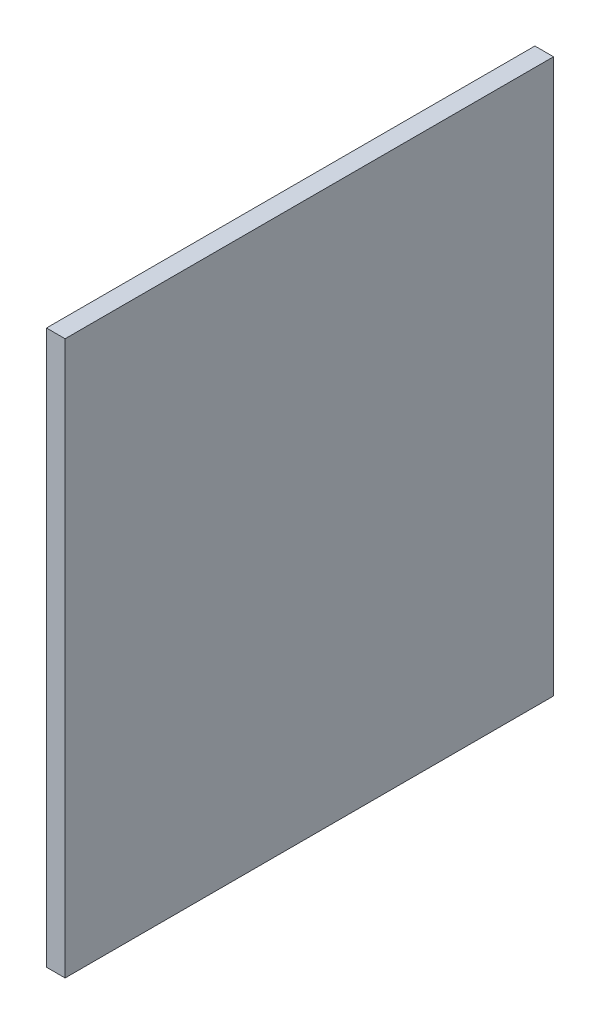
ISO-10303-21;
HEADER;
FILE_DESCRIPTION(('STEP AP214'),'2;1');
FILE_NAME('part.step','',(''),(''),'','','');
FILE_SCHEMA(('AUTOMOTIVE_DESIGN { 1 0 10303 214 1 1 1 1 }'));
ENDSEC;
DATA;
#1=APPLICATION_CONTEXT('core data for automotive mechanical design processes');
#2=APPLICATION_PROTOCOL_DEFINITION('international standard','automotive_design',2000,#1);
#3=PRODUCT_CONTEXT('',#1,'mechanical');
#4=PRODUCT('Part','Part','',(#3));
#5=PRODUCT_RELATED_PRODUCT_CATEGORY('part','',(#4));
#6=PRODUCT_DEFINITION_FORMATION('','',#4);
#7=PRODUCT_DEFINITION_CONTEXT('part definition',#1,'design');
#8=PRODUCT_DEFINITION('design','',#6,#7);
#9=PRODUCT_DEFINITION_SHAPE('','',#8);
#10=(LENGTH_UNIT() NAMED_UNIT(*) SI_UNIT(.MILLI.,.METRE.));
#11=(NAMED_UNIT(*) PLANE_ANGLE_UNIT() SI_UNIT($,.RADIAN.));
#12=(NAMED_UNIT(*) SI_UNIT($,.STERADIAN.) SOLID_ANGLE_UNIT());
#13=UNCERTAINTY_MEASURE_WITH_UNIT(LENGTH_MEASURE(1.E-05),#10,'distance_accuracy_value','');
#14=(GEOMETRIC_REPRESENTATION_CONTEXT(3) GLOBAL_UNCERTAINTY_ASSIGNED_CONTEXT((#13)) GLOBAL_UNIT_ASSIGNED_CONTEXT((#10,
#11,#12)) REPRESENTATION_CONTEXT('',''));
#15=CARTESIAN_POINT('',(0.,0.,0.));
#16=DIRECTION('',(0.,0.,1.));
#17=DIRECTION('',(1.,0.,0.));
#18=AXIS2_PLACEMENT_3D('',#15,#16,#17);
#19=CARTESIAN_POINT('',(18.,0.,0.));
#20=DIRECTION('',(0.,0.,-1.));
#21=DIRECTION('',(-1.,0.,0.));
#22=AXIS2_PLACEMENT_3D('',#19,#20,#21);
#23=PLANE('',#22);
#24=DIRECTION('',(0.,-1.,0.));
#25=VECTOR('',#24,1.);
#26=CARTESIAN_POINT('',(0.,0.,0.));
#27=LINE('',#26,#25);
#28=CARTESIAN_POINT('',(0.,535.,0.));
#29=VERTEX_POINT('',#28);
#30=CARTESIAN_POINT('',(0.,0.,0.));
#31=VERTEX_POINT('',#30);
#32=EDGE_CURVE('E96',#29,#31,#27,.T.);
#33=ORIENTED_EDGE('',*,*,#32,.T.);
#34=DIRECTION('',(-1.,0.,0.));
#35=VECTOR('',#34,1.);
#36=CARTESIAN_POINT('',(18.,0.,0.));
#37=LINE('',#36,#35);
#38=CARTESIAN_POINT('',(18.,0.,0.));
#39=VERTEX_POINT('',#38);
#40=EDGE_CURVE('E11',#39,#31,#37,.T.);
#41=ORIENTED_EDGE('',*,*,#40,.F.);
#42=DIRECTION('',(0.,-1.,0.));
#43=VECTOR('',#42,1.);
#44=CARTESIAN_POINT('',(18.,0.,0.));
#45=LINE('',#44,#43);
#46=CARTESIAN_POINT('',(18.,535.,0.));
#47=VERTEX_POINT('',#46);
#48=EDGE_CURVE('E84',#47,#39,#45,.T.);
#49=ORIENTED_EDGE('',*,*,#48,.F.);
#50=DIRECTION('',(-1.,0.,0.));
#51=VECTOR('',#50,1.);
#52=CARTESIAN_POINT('',(18.,535.,0.));
#53=LINE('',#52,#51);
#54=EDGE_CURVE('E92',#47,#29,#53,.T.);
#55=ORIENTED_EDGE('',*,*,#54,.T.);
#56=EDGE_LOOP('',(#33,#41,#49,#55));
#57=FACE_BOUND('',#56,.T.);
#58=ADVANCED_FACE('F33',(#57),#23,.F.);
#59=CARTESIAN_POINT('',(18.,0.,0.));
#60=DIRECTION('',(0.,1.,0.));
#61=DIRECTION('',(0.,0.,1.));
#62=AXIS2_PLACEMENT_3D('',#59,#60,#61);
#63=PLANE('',#62);
#64=DIRECTION('',(0.,0.,-1.));
#65=VECTOR('',#64,1.);
#66=CARTESIAN_POINT('',(0.,0.,0.));
#67=LINE('',#66,#65);
#68=CARTESIAN_POINT('',(0.,0.,-472.));
#69=VERTEX_POINT('',#68);
#70=EDGE_CURVE('E88',#31,#69,#67,.T.);
#71=ORIENTED_EDGE('',*,*,#70,.T.);
#72=DIRECTION('',(-1.,0.,0.));
#73=VECTOR('',#72,1.);
#74=CARTESIAN_POINT('',(18.,0.,-472.));
#75=LINE('',#74,#73);
#76=CARTESIAN_POINT('',(18.,0.,-472.));
#77=VERTEX_POINT('',#76);
#78=EDGE_CURVE('E41',#77,#69,#75,.T.);
#79=ORIENTED_EDGE('',*,*,#78,.F.);
#80=DIRECTION('',(0.,0.,-1.));
#81=VECTOR('',#80,1.);
#82=CARTESIAN_POINT('',(18.,0.,0.));
#83=LINE('',#82,#81);
#84=EDGE_CURVE('E79',#39,#77,#83,.T.);
#85=ORIENTED_EDGE('',*,*,#84,.F.);
#86=ORIENTED_EDGE('',*,*,#40,.T.);
#87=EDGE_LOOP('',(#71,#79,#85,#86));
#88=FACE_BOUND('',#87,.T.);
#89=ADVANCED_FACE('F87',(#88),#63,.F.);
#90=CARTESIAN_POINT('',(18.,0.,-472.));
#91=DIRECTION('',(0.,0.,1.));
#92=DIRECTION('',(1.,0.,0.));
#93=AXIS2_PLACEMENT_3D('',#90,#91,#92);
#94=PLANE('',#93);
#95=DIRECTION('',(0.,1.,0.));
#96=VECTOR('',#95,1.);
#97=CARTESIAN_POINT('',(0.,0.,-472.));
#98=LINE('',#97,#96);
#99=CARTESIAN_POINT('',(0.,535.,-472.));
#100=VERTEX_POINT('',#99);
#101=EDGE_CURVE('E66',#69,#100,#98,.T.);
#102=ORIENTED_EDGE('',*,*,#101,.T.);
#103=DIRECTION('',(-1.,0.,0.));
#104=VECTOR('',#103,1.);
#105=CARTESIAN_POINT('',(18.,535.,-472.));
#106=LINE('',#105,#104);
#107=CARTESIAN_POINT('',(18.,535.,-472.));
#108=VERTEX_POINT('',#107);
#109=EDGE_CURVE('E89',#108,#100,#106,.T.);
#110=ORIENTED_EDGE('',*,*,#109,.F.);
#111=DIRECTION('',(0.,1.,0.));
#112=VECTOR('',#111,1.);
#113=CARTESIAN_POINT('',(18.,0.,-472.));
#114=LINE('',#113,#112);
#115=EDGE_CURVE('E82',#77,#108,#114,.T.);
#116=ORIENTED_EDGE('',*,*,#115,.F.);
#117=ORIENTED_EDGE('',*,*,#78,.T.);
#118=EDGE_LOOP('',(#102,#110,#116,#117));
#119=FACE_BOUND('',#118,.T.);
#120=ADVANCED_FACE('F90',(#119),#94,.F.);
#121=CARTESIAN_POINT('',(18.,535.,0.));
#122=DIRECTION('',(0.,-1.,0.));
#123=DIRECTION('',(0.,0.,-1.));
#124=AXIS2_PLACEMENT_3D('',#121,#122,#123);
#125=PLANE('',#124);
#126=DIRECTION('',(0.,0.,1.));
#127=VECTOR('',#126,1.);
#128=CARTESIAN_POINT('',(0.,535.,0.));
#129=LINE('',#128,#127);
#130=EDGE_CURVE('E72',#100,#29,#129,.T.);
#131=ORIENTED_EDGE('',*,*,#130,.T.);
#132=ORIENTED_EDGE('',*,*,#54,.F.);
#133=DIRECTION('',(0.,0.,1.));
#134=VECTOR('',#133,1.);
#135=CARTESIAN_POINT('',(18.,535.,0.));
#136=LINE('',#135,#134);
#137=EDGE_CURVE('E49',#108,#47,#136,.T.);
#138=ORIENTED_EDGE('',*,*,#137,.F.);
#139=ORIENTED_EDGE('',*,*,#109,.T.);
#140=EDGE_LOOP('',(#131,#132,#138,#139));
#141=FACE_BOUND('',#140,.T.);
#142=ADVANCED_FACE('F103',(#141),#125,.F.);
#143=CARTESIAN_POINT('',(18.,0.,0.));
#144=DIRECTION('',(-1.,0.,0.));
#145=DIRECTION('',(0.,0.,1.));
#146=AXIS2_PLACEMENT_3D('',#143,#144,#145);
#147=PLANE('',#146);
#148=ORIENTED_EDGE('',*,*,#48,.T.);
#149=ORIENTED_EDGE('',*,*,#84,.T.);
#150=ORIENTED_EDGE('',*,*,#115,.T.);
#151=ORIENTED_EDGE('',*,*,#137,.T.);
#152=EDGE_LOOP('',(#148,#149,#150,#151));
#153=FACE_BOUND('',#152,.T.);
#154=ADVANCED_FACE('F80',(#153),#147,.F.);
#155=CARTESIAN_POINT('',(0.,0.,0.));
#156=DIRECTION('',(-1.,0.,0.));
#157=DIRECTION('',(0.,0.,1.));
#158=AXIS2_PLACEMENT_3D('',#155,#156,#157);
#159=PLANE('',#158);
#160=ORIENTED_EDGE('',*,*,#32,.F.);
#161=ORIENTED_EDGE('',*,*,#130,.F.);
#162=ORIENTED_EDGE('',*,*,#101,.F.);
#163=ORIENTED_EDGE('',*,*,#70,.F.);
#164=EDGE_LOOP('',(#160,#161,#162,#163));
#165=FACE_BOUND('',#164,.T.);
#166=ADVANCED_FACE('F106',(#165),#159,.T.);
#167=CLOSED_SHELL('',(#58,#89,#120,#142,#154,#166));
#168=MANIFOLD_SOLID_BREP('B2',#167);
#169=ADVANCED_BREP_SHAPE_REPRESENTATION('',(#18,#168),#14);
#170=SHAPE_DEFINITION_REPRESENTATION(#9,#169);
ENDSEC;
END-ISO-10303-21;
